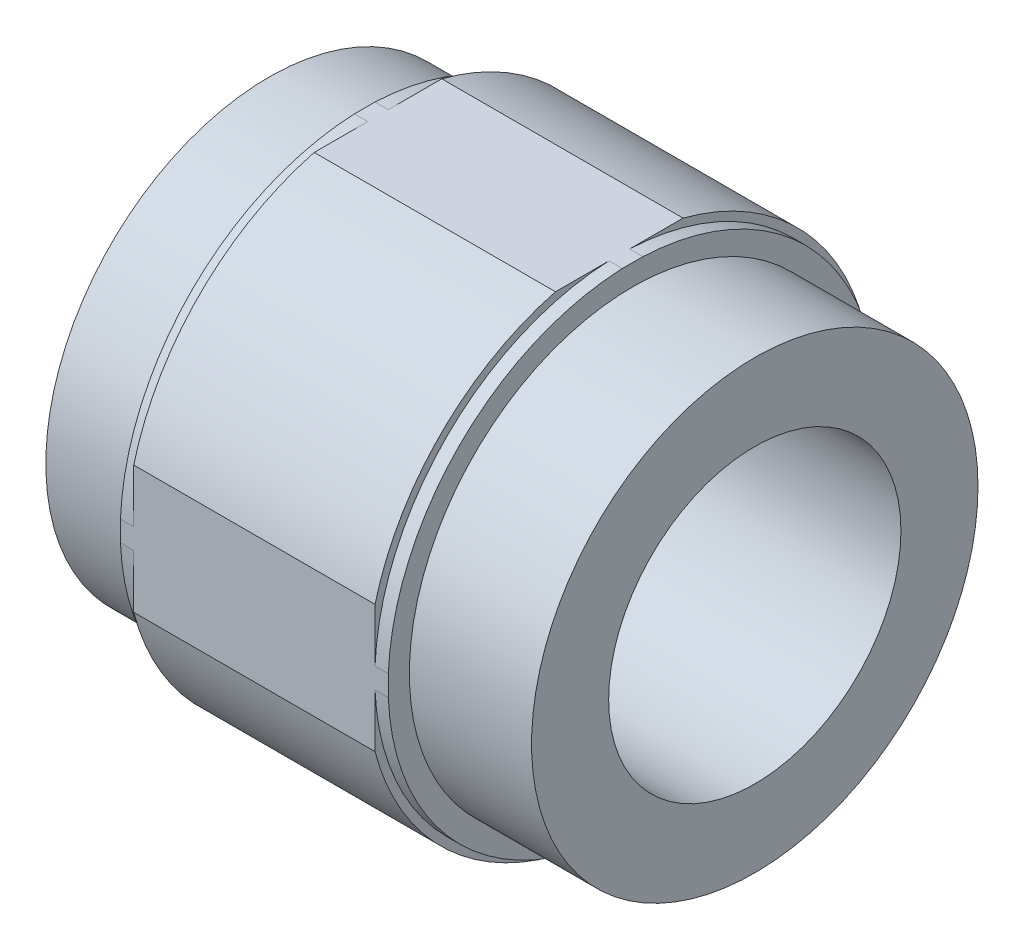
ISO-10303-21;
HEADER;
FILE_DESCRIPTION(('STEP AP214'),'2;1');
FILE_NAME('part.step','',(''),(''),'','','');
FILE_SCHEMA(('AUTOMOTIVE_DESIGN { 1 0 10303 214 1 1 1 1 }'));
ENDSEC;
DATA;
#1=APPLICATION_CONTEXT('core data for automotive mechanical design processes');
#2=APPLICATION_PROTOCOL_DEFINITION('international standard','automotive_design',2000,#1);
#3=PRODUCT_CONTEXT('',#1,'mechanical');
#4=PRODUCT('Part','Part','',(#3));
#5=PRODUCT_RELATED_PRODUCT_CATEGORY('part','',(#4));
#6=PRODUCT_DEFINITION_FORMATION('','',#4);
#7=PRODUCT_DEFINITION_CONTEXT('part definition',#1,'design');
#8=PRODUCT_DEFINITION('design','',#6,#7);
#9=PRODUCT_DEFINITION_SHAPE('','',#8);
#10=(LENGTH_UNIT() NAMED_UNIT(*) SI_UNIT(.MILLI.,.METRE.));
#11=(NAMED_UNIT(*) PLANE_ANGLE_UNIT() SI_UNIT($,.RADIAN.));
#12=(NAMED_UNIT(*) SI_UNIT($,.STERADIAN.) SOLID_ANGLE_UNIT());
#13=UNCERTAINTY_MEASURE_WITH_UNIT(LENGTH_MEASURE(1.E-05),#10,'distance_accuracy_value','');
#14=(GEOMETRIC_REPRESENTATION_CONTEXT(3) GLOBAL_UNCERTAINTY_ASSIGNED_CONTEXT((#13)) GLOBAL_UNIT_ASSIGNED_CONTEXT((#10,
#11,#12)) REPRESENTATION_CONTEXT('',''));
#15=CARTESIAN_POINT('',(0.,0.,0.));
#16=DIRECTION('',(0.,0.,1.));
#17=DIRECTION('',(1.,0.,0.));
#18=AXIS2_PLACEMENT_3D('',#15,#16,#17);
#19=CARTESIAN_POINT('',(-22.7,0.,0.));
#20=DIRECTION('',(1.,0.,0.));
#21=DIRECTION('',(0.,0.,-1.));
#22=AXIS2_PLACEMENT_3D('',#19,#20,#21);
#23=PLANE('',#22);
#24=CARTESIAN_POINT('',(-22.7,0.,0.));
#25=DIRECTION('',(1.,0.,0.));
#26=DIRECTION('',(0.,0.,-1.));
#27=AXIS2_PLACEMENT_3D('',#24,#25,#26);
#28=CIRCLE('',#27,46.);
#29=CARTESIAN_POINT('',(-22.7,-1.9364916731039,-45.959221055192));
#30=VERTEX_POINT('',#29);
#31=CARTESIAN_POINT('',(-22.7,-45.959221055192,-1.93649167310388));
#32=VERTEX_POINT('',#31);
#33=EDGE_CURVE('E191',#30,#32,#28,.F.);
#34=ORIENTED_EDGE('',*,*,#33,.F.);
#35=DIRECTION('',(0.,-1.,0.));
#36=VECTOR('',#35,1.);
#37=CARTESIAN_POINT('',(-22.7,-12.,-45.959221055192));
#38=LINE('',#37,#36);
#39=CARTESIAN_POINT('',(-22.7,-12.,-45.959221055192));
#40=VERTEX_POINT('',#39);
#41=EDGE_CURVE('E181',#30,#40,#38,.T.);
#42=ORIENTED_EDGE('',*,*,#41,.T.);
#43=CARTESIAN_POINT('',(-22.7,0.,0.));
#44=DIRECTION('',(1.,0.,0.));
#45=DIRECTION('',(0.,0.,-1.));
#46=AXIS2_PLACEMENT_3D('',#43,#44,#45);
#47=CIRCLE('',#46,47.5);
#48=CARTESIAN_POINT('',(-22.7,-45.959221055192,-12.));
#49=VERTEX_POINT('',#48);
#50=EDGE_CURVE('E21',#49,#40,#47,.T.);
#51=ORIENTED_EDGE('',*,*,#50,.F.);
#52=DIRECTION('',(0.,0.,1.));
#53=VECTOR('',#52,1.);
#54=CARTESIAN_POINT('',(-22.7,-45.959221055192,12.));
#55=LINE('',#54,#53);
#56=EDGE_CURVE('E178',#49,#32,#55,.T.);
#57=ORIENTED_EDGE('',*,*,#56,.T.);
#58=EDGE_LOOP('',(#34,#42,#51,#57));
#59=FACE_BOUND('',#58,.T.);
#60=ADVANCED_FACE('F17',(#59),#23,.F.);
#61=CARTESIAN_POINT('',(0.,0.,0.));
#62=DIRECTION('',(1.,0.,0.));
#63=DIRECTION('',(0.,0.,-1.));
#64=AXIS2_PLACEMENT_3D('',#61,#62,#63);
#65=CYLINDRICAL_SURFACE('',#64,47.5);
#66=DIRECTION('',(1.,0.,0.));
#67=VECTOR('',#66,1.);
#68=CARTESIAN_POINT('',(-25.2,-12.,-45.959221055192));
#69=LINE('',#68,#67);
#70=CARTESIAN_POINT('',(22.7,-12.,-45.959221055192));
#71=VERTEX_POINT('',#70);
#72=EDGE_CURVE('E325',#40,#71,#69,.T.);
#73=ORIENTED_EDGE('',*,*,#72,.T.);
#74=CARTESIAN_POINT('',(22.7,0.,0.));
#75=DIRECTION('',(1.,0.,0.));
#76=DIRECTION('',(0.,0.,-1.));
#77=AXIS2_PLACEMENT_3D('',#74,#75,#76);
#78=CIRCLE('',#77,47.5);
#79=CARTESIAN_POINT('',(22.7,-45.959221055192,-12.));
#80=VERTEX_POINT('',#79);
#81=EDGE_CURVE('E184',#71,#80,#78,.F.);
#82=ORIENTED_EDGE('',*,*,#81,.T.);
#83=DIRECTION('',(1.,0.,0.));
#84=VECTOR('',#83,1.);
#85=CARTESIAN_POINT('',(-25.2,-45.959221055192,-12.));
#86=LINE('',#85,#84);
#87=EDGE_CURVE('E186',#80,#49,#86,.F.);
#88=ORIENTED_EDGE('',*,*,#87,.T.);
#89=ORIENTED_EDGE('',*,*,#50,.T.);
#90=EDGE_LOOP('',(#73,#82,#88,#89));
#91=FACE_BOUND('',#90,.T.);
#92=ADVANCED_FACE('F187',(#91),#65,.T.);
#93=CARTESIAN_POINT('',(22.7,0.,0.));
#94=DIRECTION('',(-1.,0.,0.));
#95=DIRECTION('',(0.,0.,1.));
#96=AXIS2_PLACEMENT_3D('',#93,#94,#95);
#97=PLANE('',#96);
#98=ORIENTED_EDGE('',*,*,#81,.F.);
#99=DIRECTION('',(0.,-1.,0.));
#100=VECTOR('',#99,1.);
#101=CARTESIAN_POINT('',(22.7,-12.,-45.959221055192));
#102=LINE('',#101,#100);
#103=CARTESIAN_POINT('',(22.7,-1.9364916731039,-45.959221055192));
#104=VERTEX_POINT('',#103);
#105=EDGE_CURVE('E323',#71,#104,#102,.F.);
#106=ORIENTED_EDGE('',*,*,#105,.T.);
#107=CARTESIAN_POINT('',(22.7,0.,0.));
#108=DIRECTION('',(1.,0.,0.));
#109=DIRECTION('',(0.,0.,-1.));
#110=AXIS2_PLACEMENT_3D('',#107,#108,#109);
#111=CIRCLE('',#110,46.);
#112=CARTESIAN_POINT('',(22.7,-45.959221055192,-1.93649167310388));
#113=VERTEX_POINT('',#112);
#114=EDGE_CURVE('E263',#113,#104,#111,.T.);
#115=ORIENTED_EDGE('',*,*,#114,.F.);
#116=DIRECTION('',(0.,0.,1.));
#117=VECTOR('',#116,1.);
#118=CARTESIAN_POINT('',(22.7,-45.959221055192,12.));
#119=LINE('',#118,#117);
#120=EDGE_CURVE('E331',#113,#80,#119,.F.);
#121=ORIENTED_EDGE('',*,*,#120,.T.);
#122=EDGE_LOOP('',(#98,#106,#115,#121));
#123=FACE_BOUND('',#122,.T.);
#124=ADVANCED_FACE('F707',(#123),#97,.F.);
#125=CARTESIAN_POINT('',(-22.7,0.,0.));
#126=DIRECTION('',(1.,0.,0.));
#127=DIRECTION('',(0.,0.,-1.));
#128=AXIS2_PLACEMENT_3D('',#125,#126,#127);
#129=PLANE('',#128);
#130=CARTESIAN_POINT('',(-22.7,0.,0.));
#131=DIRECTION('',(1.,0.,0.));
#132=DIRECTION('',(0.,0.,-1.));
#133=AXIS2_PLACEMENT_3D('',#130,#131,#132);
#134=CIRCLE('',#133,46.);
#135=CARTESIAN_POINT('',(-22.7,45.959221055192,-1.93649167310389));
#136=VERTEX_POINT('',#135);
#137=CARTESIAN_POINT('',(-22.7,1.93649167310388,-45.959221055192));
#138=VERTEX_POINT('',#137);
#139=EDGE_CURVE('E269',#136,#138,#134,.F.);
#140=ORIENTED_EDGE('',*,*,#139,.F.);
#141=DIRECTION('',(0.,0.,-1.));
#142=VECTOR('',#141,1.);
#143=CARTESIAN_POINT('',(-22.7,45.959221055192,-12.));
#144=LINE('',#143,#142);
#145=CARTESIAN_POINT('',(-22.7,45.959221055192,-12.));
#146=VERTEX_POINT('',#145);
#147=EDGE_CURVE('E304',#136,#146,#144,.T.);
#148=ORIENTED_EDGE('',*,*,#147,.T.);
#149=CARTESIAN_POINT('',(-22.7,0.,0.));
#150=DIRECTION('',(1.,0.,0.));
#151=DIRECTION('',(0.,0.,-1.));
#152=AXIS2_PLACEMENT_3D('',#149,#150,#151);
#153=CIRCLE('',#152,47.5);
#154=CARTESIAN_POINT('',(-22.7,12.,-45.959221055192));
#155=VERTEX_POINT('',#154);
#156=EDGE_CURVE('E289',#155,#146,#153,.T.);
#157=ORIENTED_EDGE('',*,*,#156,.F.);
#158=DIRECTION('',(0.,-1.,0.));
#159=VECTOR('',#158,1.);
#160=CARTESIAN_POINT('',(-22.7,-12.,-45.959221055192));
#161=LINE('',#160,#159);
#162=EDGE_CURVE('E322',#155,#138,#161,.T.);
#163=ORIENTED_EDGE('',*,*,#162,.T.);
#164=EDGE_LOOP('',(#140,#148,#157,#163));
#165=FACE_BOUND('',#164,.T.);
#166=ADVANCED_FACE('F699',(#165),#129,.F.);
#167=CARTESIAN_POINT('',(0.,0.,0.));
#168=DIRECTION('',(1.,0.,0.));
#169=DIRECTION('',(0.,0.,-1.));
#170=AXIS2_PLACEMENT_3D('',#167,#168,#169);
#171=CYLINDRICAL_SURFACE('',#170,47.5);
#172=DIRECTION('',(1.,0.,0.));
#173=VECTOR('',#172,1.);
#174=CARTESIAN_POINT('',(-25.2,45.959221055192,-12.));
#175=LINE('',#174,#173);
#176=CARTESIAN_POINT('',(22.7,45.959221055192,-12.));
#177=VERTEX_POINT('',#176);
#178=EDGE_CURVE('E295',#146,#177,#175,.T.);
#179=ORIENTED_EDGE('',*,*,#178,.T.);
#180=CARTESIAN_POINT('',(22.7,0.,0.));
#181=DIRECTION('',(1.,0.,0.));
#182=DIRECTION('',(0.,0.,-1.));
#183=AXIS2_PLACEMENT_3D('',#180,#181,#182);
#184=CIRCLE('',#183,47.5);
#185=CARTESIAN_POINT('',(22.7,12.,-45.959221055192));
#186=VERTEX_POINT('',#185);
#187=EDGE_CURVE('E287',#177,#186,#184,.F.);
#188=ORIENTED_EDGE('',*,*,#187,.T.);
#189=DIRECTION('',(1.,0.,0.));
#190=VECTOR('',#189,1.);
#191=CARTESIAN_POINT('',(-25.2,12.,-45.959221055192));
#192=LINE('',#191,#190);
#193=EDGE_CURVE('E266',#186,#155,#192,.F.);
#194=ORIENTED_EDGE('',*,*,#193,.T.);
#195=ORIENTED_EDGE('',*,*,#156,.T.);
#196=EDGE_LOOP('',(#179,#188,#194,#195));
#197=FACE_BOUND('',#196,.T.);
#198=ADVANCED_FACE('F294',(#197),#171,.T.);
#199=CARTESIAN_POINT('',(22.7,0.,0.));
#200=DIRECTION('',(-1.,0.,0.));
#201=DIRECTION('',(0.,0.,1.));
#202=AXIS2_PLACEMENT_3D('',#199,#200,#201);
#203=PLANE('',#202);
#204=ORIENTED_EDGE('',*,*,#187,.F.);
#205=DIRECTION('',(0.,0.,-1.));
#206=VECTOR('',#205,1.);
#207=CARTESIAN_POINT('',(22.7,45.959221055192,-12.));
#208=LINE('',#207,#206);
#209=CARTESIAN_POINT('',(22.7,45.959221055192,-1.93649167310389));
#210=VERTEX_POINT('',#209);
#211=EDGE_CURVE('E306',#177,#210,#208,.F.);
#212=ORIENTED_EDGE('',*,*,#211,.T.);
#213=CARTESIAN_POINT('',(22.7,0.,0.));
#214=DIRECTION('',(1.,0.,0.));
#215=DIRECTION('',(0.,0.,-1.));
#216=AXIS2_PLACEMENT_3D('',#213,#214,#215);
#217=CIRCLE('',#216,46.);
#218=CARTESIAN_POINT('',(22.7,1.93649167310388,-45.959221055192));
#219=VERTEX_POINT('',#218);
#220=EDGE_CURVE('E258',#219,#210,#217,.T.);
#221=ORIENTED_EDGE('',*,*,#220,.F.);
#222=DIRECTION('',(0.,-1.,0.));
#223=VECTOR('',#222,1.);
#224=CARTESIAN_POINT('',(22.7,-12.,-45.959221055192));
#225=LINE('',#224,#223);
#226=EDGE_CURVE('E317',#219,#186,#225,.F.);
#227=ORIENTED_EDGE('',*,*,#226,.T.);
#228=EDGE_LOOP('',(#204,#212,#221,#227));
#229=FACE_BOUND('',#228,.T.);
#230=ADVANCED_FACE('F531',(#229),#203,.F.);
#231=CARTESIAN_POINT('',(0.,0.,0.));
#232=DIRECTION('',(1.,0.,0.));
#233=DIRECTION('',(0.,0.,-1.));
#234=AXIS2_PLACEMENT_3D('',#231,#232,#233);
#235=CYLINDRICAL_SURFACE('',#234,47.5);
#236=DIRECTION('',(1.,0.,0.));
#237=VECTOR('',#236,1.);
#238=CARTESIAN_POINT('',(-25.2,-12.,45.959221055192));
#239=LINE('',#238,#237);
#240=CARTESIAN_POINT('',(22.7,-12.,45.959221055192));
#241=VERTEX_POINT('',#240);
#242=CARTESIAN_POINT('',(-22.7,-12.,45.959221055192));
#243=VERTEX_POINT('',#242);
#244=EDGE_CURVE('E256',#241,#243,#239,.F.);
#245=ORIENTED_EDGE('',*,*,#244,.T.);
#246=CARTESIAN_POINT('',(-22.7,0.,0.));
#247=DIRECTION('',(1.,0.,0.));
#248=DIRECTION('',(0.,0.,-1.));
#249=AXIS2_PLACEMENT_3D('',#246,#247,#248);
#250=CIRCLE('',#249,47.5);
#251=CARTESIAN_POINT('',(-22.7,-45.959221055192,12.));
#252=VERTEX_POINT('',#251);
#253=EDGE_CURVE('E285',#243,#252,#250,.T.);
#254=ORIENTED_EDGE('',*,*,#253,.T.);
#255=DIRECTION('',(1.,0.,0.));
#256=VECTOR('',#255,1.);
#257=CARTESIAN_POINT('',(-25.2,-45.959221055192,12.));
#258=LINE('',#257,#256);
#259=CARTESIAN_POINT('',(22.7,-45.959221055192,12.));
#260=VERTEX_POINT('',#259);
#261=EDGE_CURVE('E333',#252,#260,#258,.T.);
#262=ORIENTED_EDGE('',*,*,#261,.T.);
#263=CARTESIAN_POINT('',(22.7,0.,0.));
#264=DIRECTION('',(1.,0.,0.));
#265=DIRECTION('',(0.,0.,-1.));
#266=AXIS2_PLACEMENT_3D('',#263,#264,#265);
#267=CIRCLE('',#266,47.5);
#268=EDGE_CURVE('E278',#260,#241,#267,.F.);
#269=ORIENTED_EDGE('',*,*,#268,.T.);
#270=EDGE_LOOP('',(#245,#254,#262,#269));
#271=FACE_BOUND('',#270,.T.);
#272=ADVANCED_FACE('F522',(#271),#235,.T.);
#273=CARTESIAN_POINT('',(-22.7,0.,0.));
#274=DIRECTION('',(1.,0.,0.));
#275=DIRECTION('',(0.,0.,-1.));
#276=AXIS2_PLACEMENT_3D('',#273,#274,#275);
#277=PLANE('',#276);
#278=ORIENTED_EDGE('',*,*,#253,.F.);
#279=DIRECTION('',(0.,1.,0.));
#280=VECTOR('',#279,1.);
#281=CARTESIAN_POINT('',(-22.7,12.,45.959221055192));
#282=LINE('',#281,#280);
#283=CARTESIAN_POINT('',(-22.7,-1.93649167310388,45.959221055192));
#284=VERTEX_POINT('',#283);
#285=EDGE_CURVE('E354',#243,#284,#282,.T.);
#286=ORIENTED_EDGE('',*,*,#285,.T.);
#287=CARTESIAN_POINT('',(-22.7,0.,0.));
#288=DIRECTION('',(1.,0.,0.));
#289=DIRECTION('',(0.,0.,-1.));
#290=AXIS2_PLACEMENT_3D('',#287,#288,#289);
#291=CIRCLE('',#290,46.);
#292=CARTESIAN_POINT('',(-22.7,-45.959221055192,1.93649167310389));
#293=VERTEX_POINT('',#292);
#294=EDGE_CURVE('E275',#293,#284,#291,.F.);
#295=ORIENTED_EDGE('',*,*,#294,.F.);
#296=DIRECTION('',(0.,0.,1.));
#297=VECTOR('',#296,1.);
#298=CARTESIAN_POINT('',(-22.7,-45.959221055192,12.));
#299=LINE('',#298,#297);
#300=EDGE_CURVE('E201',#293,#252,#299,.T.);
#301=ORIENTED_EDGE('',*,*,#300,.T.);
#302=EDGE_LOOP('',(#278,#286,#295,#301));
#303=FACE_BOUND('',#302,.T.);
#304=ADVANCED_FACE('F523',(#303),#277,.F.);
#305=CARTESIAN_POINT('',(-22.7,0.,0.));
#306=DIRECTION('',(1.,0.,0.));
#307=DIRECTION('',(0.,0.,-1.));
#308=AXIS2_PLACEMENT_3D('',#305,#306,#307);
#309=PLANE('',#308);
#310=CARTESIAN_POINT('',(-22.7,0.,0.));
#311=DIRECTION('',(1.,0.,0.));
#312=DIRECTION('',(0.,0.,-1.));
#313=AXIS2_PLACEMENT_3D('',#310,#311,#312);
#314=CIRCLE('',#313,47.5);
#315=CARTESIAN_POINT('',(-22.7,45.959221055192,12.));
#316=VERTEX_POINT('',#315);
#317=CARTESIAN_POINT('',(-22.7,12.,45.959221055192));
#318=VERTEX_POINT('',#317);
#319=EDGE_CURVE('E282',#316,#318,#314,.T.);
#320=ORIENTED_EDGE('',*,*,#319,.F.);
#321=DIRECTION('',(0.,0.,-1.));
#322=VECTOR('',#321,1.);
#323=CARTESIAN_POINT('',(-22.7,45.959221055192,-12.));
#324=LINE('',#323,#322);
#325=CARTESIAN_POINT('',(-22.7,45.959221055192,1.93649167310389));
#326=VERTEX_POINT('',#325);
#327=EDGE_CURVE('E314',#316,#326,#324,.T.);
#328=ORIENTED_EDGE('',*,*,#327,.T.);
#329=CARTESIAN_POINT('',(-22.7,0.,0.));
#330=DIRECTION('',(1.,0.,0.));
#331=DIRECTION('',(0.,0.,-1.));
#332=AXIS2_PLACEMENT_3D('',#329,#330,#331);
#333=CIRCLE('',#332,46.);
#334=CARTESIAN_POINT('',(-22.7,1.9364916731039,45.959221055192));
#335=VERTEX_POINT('',#334);
#336=EDGE_CURVE('E272',#335,#326,#333,.F.);
#337=ORIENTED_EDGE('',*,*,#336,.F.);
#338=DIRECTION('',(0.,1.,0.));
#339=VECTOR('',#338,1.);
#340=CARTESIAN_POINT('',(-22.7,12.,45.959221055192));
#341=LINE('',#340,#339);
#342=EDGE_CURVE('E359',#335,#318,#341,.T.);
#343=ORIENTED_EDGE('',*,*,#342,.T.);
#344=EDGE_LOOP('',(#320,#328,#337,#343));
#345=FACE_BOUND('',#344,.T.);
#346=ADVANCED_FACE('F376',(#345),#309,.F.);
#347=CARTESIAN_POINT('',(0.,0.,0.));
#348=DIRECTION('',(1.,0.,0.));
#349=DIRECTION('',(0.,0.,-1.));
#350=AXIS2_PLACEMENT_3D('',#347,#348,#349);
#351=CYLINDRICAL_SURFACE('',#350,47.5);
#352=DIRECTION('',(1.,0.,0.));
#353=VECTOR('',#352,1.);
#354=CARTESIAN_POINT('',(-25.2,45.959221055192,12.));
#355=LINE('',#354,#353);
#356=CARTESIAN_POINT('',(22.7,45.959221055192,12.));
#357=VERTEX_POINT('',#356);
#358=EDGE_CURVE('E261',#357,#316,#355,.F.);
#359=ORIENTED_EDGE('',*,*,#358,.T.);
#360=ORIENTED_EDGE('',*,*,#319,.T.);
#361=DIRECTION('',(1.,0.,0.));
#362=VECTOR('',#361,1.);
#363=CARTESIAN_POINT('',(-25.2,12.,45.959221055192));
#364=LINE('',#363,#362);
#365=CARTESIAN_POINT('',(22.7,12.,45.959221055192));
#366=VERTEX_POINT('',#365);
#367=EDGE_CURVE('E357',#318,#366,#364,.T.);
#368=ORIENTED_EDGE('',*,*,#367,.T.);
#369=CARTESIAN_POINT('',(22.7,0.,0.));
#370=DIRECTION('',(1.,0.,0.));
#371=DIRECTION('',(0.,0.,-1.));
#372=AXIS2_PLACEMENT_3D('',#369,#370,#371);
#373=CIRCLE('',#372,47.5);
#374=EDGE_CURVE('E280',#366,#357,#373,.F.);
#375=ORIENTED_EDGE('',*,*,#374,.T.);
#376=EDGE_LOOP('',(#359,#360,#368,#375));
#377=FACE_BOUND('',#376,.T.);
#378=ADVANCED_FACE('F370',(#377),#351,.T.);
#379=CARTESIAN_POINT('',(22.7,0.,0.));
#380=DIRECTION('',(-1.,0.,0.));
#381=DIRECTION('',(0.,0.,1.));
#382=AXIS2_PLACEMENT_3D('',#379,#380,#381);
#383=PLANE('',#382);
#384=CARTESIAN_POINT('',(22.7,0.,0.));
#385=DIRECTION('',(1.,0.,0.));
#386=DIRECTION('',(0.,0.,-1.));
#387=AXIS2_PLACEMENT_3D('',#384,#385,#386);
#388=CIRCLE('',#387,46.);
#389=CARTESIAN_POINT('',(22.7,45.959221055192,1.93649167310389));
#390=VERTEX_POINT('',#389);
#391=CARTESIAN_POINT('',(22.7,1.9364916731039,45.959221055192));
#392=VERTEX_POINT('',#391);
#393=EDGE_CURVE('E253',#390,#392,#388,.T.);
#394=ORIENTED_EDGE('',*,*,#393,.F.);
#395=DIRECTION('',(0.,0.,-1.));
#396=VECTOR('',#395,1.);
#397=CARTESIAN_POINT('',(22.7,45.959221055192,-12.));
#398=LINE('',#397,#396);
#399=EDGE_CURVE('E364',#390,#357,#398,.F.);
#400=ORIENTED_EDGE('',*,*,#399,.T.);
#401=ORIENTED_EDGE('',*,*,#374,.F.);
#402=DIRECTION('',(0.,1.,0.));
#403=VECTOR('',#402,1.);
#404=CARTESIAN_POINT('',(22.7,12.,45.959221055192));
#405=LINE('',#404,#403);
#406=EDGE_CURVE('E355',#366,#392,#405,.F.);
#407=ORIENTED_EDGE('',*,*,#406,.T.);
#408=EDGE_LOOP('',(#394,#400,#401,#407));
#409=FACE_BOUND('',#408,.T.);
#410=ADVANCED_FACE('F389',(#409),#383,.F.);
#411=CARTESIAN_POINT('',(22.7,0.,0.));
#412=DIRECTION('',(-1.,0.,0.));
#413=DIRECTION('',(0.,0.,1.));
#414=AXIS2_PLACEMENT_3D('',#411,#412,#413);
#415=PLANE('',#414);
#416=CARTESIAN_POINT('',(22.7,0.,0.));
#417=DIRECTION('',(1.,0.,0.));
#418=DIRECTION('',(0.,0.,-1.));
#419=AXIS2_PLACEMENT_3D('',#416,#417,#418);
#420=CIRCLE('',#419,46.);
#421=CARTESIAN_POINT('',(22.7,-1.93649167310387,45.959221055192));
#422=VERTEX_POINT('',#421);
#423=CARTESIAN_POINT('',(22.7,-45.959221055192,1.9364916731039));
#424=VERTEX_POINT('',#423);
#425=EDGE_CURVE('E250',#422,#424,#420,.T.);
#426=ORIENTED_EDGE('',*,*,#425,.F.);
#427=DIRECTION('',(0.,1.,0.));
#428=VECTOR('',#427,1.);
#429=CARTESIAN_POINT('',(22.7,12.,45.959221055192));
#430=LINE('',#429,#428);
#431=EDGE_CURVE('E348',#422,#241,#430,.F.);
#432=ORIENTED_EDGE('',*,*,#431,.T.);
#433=ORIENTED_EDGE('',*,*,#268,.F.);
#434=DIRECTION('',(0.,0.,1.));
#435=VECTOR('',#434,1.);
#436=CARTESIAN_POINT('',(22.7,-45.959221055192,12.));
#437=LINE('',#436,#435);
#438=EDGE_CURVE('E332',#260,#424,#437,.F.);
#439=ORIENTED_EDGE('',*,*,#438,.T.);
#440=EDGE_LOOP('',(#426,#432,#433,#439));
#441=FACE_BOUND('',#440,.T.);
#442=ADVANCED_FACE('F520',(#441),#415,.F.);
#443=CARTESIAN_POINT('',(-25.2,0.,0.));
#444=DIRECTION('',(1.,0.,0.));
#445=DIRECTION('',(0.,0.,-1.));
#446=AXIS2_PLACEMENT_3D('',#443,#444,#445);
#447=CYLINDRICAL_SURFACE('',#446,46.);
#448=DIRECTION('',(1.,0.,0.));
#449=VECTOR('',#448,1.);
#450=CARTESIAN_POINT('',(-25.2,-1.93649167310383,45.959221055192));
#451=LINE('',#450,#449);
#452=CARTESIAN_POINT('',(-25.2,-1.93649167310388,45.959221055192));
#453=VERTEX_POINT('',#452);
#454=EDGE_CURVE('E363',#284,#453,#451,.F.);
#455=ORIENTED_EDGE('',*,*,#454,.T.);
#456=CARTESIAN_POINT('',(-25.2,0.,0.));
#457=DIRECTION('',(1.,0.,0.));
#458=DIRECTION('',(0.,0.,-1.));
#459=AXIS2_PLACEMENT_3D('',#456,#457,#458);
#460=CIRCLE('',#459,46.);
#461=CARTESIAN_POINT('',(-25.2,-45.959221055192,1.93649167310389));
#462=VERTEX_POINT('',#461);
#463=EDGE_CURVE('E246',#462,#453,#460,.F.);
#464=ORIENTED_EDGE('',*,*,#463,.F.);
#465=DIRECTION('',(1.,0.,0.));
#466=VECTOR('',#465,1.);
#467=CARTESIAN_POINT('',(-25.2,-45.959221055192,1.93649167310384));
#468=LINE('',#467,#466);
#469=EDGE_CURVE('E198',#462,#293,#468,.T.);
#470=ORIENTED_EDGE('',*,*,#469,.T.);
#471=ORIENTED_EDGE('',*,*,#294,.T.);
#472=EDGE_LOOP('',(#455,#464,#470,#471));
#473=FACE_BOUND('',#472,.T.);
#474=ADVANCED_FACE('F427',(#473),#447,.T.);
#475=CARTESIAN_POINT('',(-25.2,0.,0.));
#476=DIRECTION('',(1.,0.,0.));
#477=DIRECTION('',(0.,0.,-1.));
#478=AXIS2_PLACEMENT_3D('',#475,#476,#477);
#479=CYLINDRICAL_SURFACE('',#478,46.);
#480=DIRECTION('',(1.,0.,0.));
#481=VECTOR('',#480,1.);
#482=CARTESIAN_POINT('',(-25.2,45.959221055192,1.93649167310384));
#483=LINE('',#482,#481);
#484=CARTESIAN_POINT('',(-25.2,45.959221055192,1.93649167310389));
#485=VERTEX_POINT('',#484);
#486=EDGE_CURVE('E316',#326,#485,#483,.F.);
#487=ORIENTED_EDGE('',*,*,#486,.T.);
#488=CARTESIAN_POINT('',(-25.2,0.,0.));
#489=DIRECTION('',(1.,0.,0.));
#490=DIRECTION('',(0.,0.,-1.));
#491=AXIS2_PLACEMENT_3D('',#488,#489,#490);
#492=CIRCLE('',#491,46.);
#493=CARTESIAN_POINT('',(-25.2,1.93649167310389,45.959221055192));
#494=VERTEX_POINT('',#493);
#495=EDGE_CURVE('E242',#494,#485,#492,.F.);
#496=ORIENTED_EDGE('',*,*,#495,.F.);
#497=DIRECTION('',(1.,0.,0.));
#498=VECTOR('',#497,1.);
#499=CARTESIAN_POINT('',(-25.2,1.93649167310385,45.959221055192));
#500=LINE('',#499,#498);
#501=EDGE_CURVE('E361',#494,#335,#500,.T.);
#502=ORIENTED_EDGE('',*,*,#501,.T.);
#503=ORIENTED_EDGE('',*,*,#336,.T.);
#504=EDGE_LOOP('',(#487,#496,#502,#503));
#505=FACE_BOUND('',#504,.T.);
#506=ADVANCED_FACE('F379',(#505),#479,.T.);
#507=CARTESIAN_POINT('',(-25.2,0.,0.));
#508=DIRECTION('',(1.,0.,0.));
#509=DIRECTION('',(0.,0.,-1.));
#510=AXIS2_PLACEMENT_3D('',#507,#508,#509);
#511=CYLINDRICAL_SURFACE('',#510,46.);
#512=DIRECTION('',(1.,0.,0.));
#513=VECTOR('',#512,1.);
#514=CARTESIAN_POINT('',(-25.2,45.959221055192,-1.93649167310384));
#515=LINE('',#514,#513);
#516=CARTESIAN_POINT('',(-25.2,45.959221055192,-1.93649167310389));
#517=VERTEX_POINT('',#516);
#518=EDGE_CURVE('E310',#517,#136,#515,.T.);
#519=ORIENTED_EDGE('',*,*,#518,.T.);
#520=ORIENTED_EDGE('',*,*,#139,.T.);
#521=DIRECTION('',(1.,0.,0.));
#522=VECTOR('',#521,1.);
#523=CARTESIAN_POINT('',(-25.2,1.93649167310383,-45.959221055192));
#524=LINE('',#523,#522);
#525=CARTESIAN_POINT('',(-25.2,1.93649167310388,-45.959221055192));
#526=VERTEX_POINT('',#525);
#527=EDGE_CURVE('E330',#138,#526,#524,.F.);
#528=ORIENTED_EDGE('',*,*,#527,.T.);
#529=CARTESIAN_POINT('',(-25.2,0.,0.));
#530=DIRECTION('',(1.,0.,0.));
#531=DIRECTION('',(0.,0.,-1.));
#532=AXIS2_PLACEMENT_3D('',#529,#530,#531);
#533=CIRCLE('',#532,46.);
#534=EDGE_CURVE('E238',#517,#526,#533,.F.);
#535=ORIENTED_EDGE('',*,*,#534,.F.);
#536=EDGE_LOOP('',(#519,#520,#528,#535));
#537=FACE_BOUND('',#536,.T.);
#538=ADVANCED_FACE('F446',(#537),#511,.T.);
#539=CARTESIAN_POINT('',(-25.2,0.,0.));
#540=DIRECTION('',(1.,0.,0.));
#541=DIRECTION('',(0.,0.,-1.));
#542=AXIS2_PLACEMENT_3D('',#539,#540,#541);
#543=CYLINDRICAL_SURFACE('',#542,46.);
#544=DIRECTION('',(1.,0.,0.));
#545=VECTOR('',#544,1.);
#546=CARTESIAN_POINT('',(-25.2,-1.93649167310385,-45.959221055192));
#547=LINE('',#546,#545);
#548=CARTESIAN_POINT('',(-25.2,-1.93649167310389,-45.959221055192));
#549=VERTEX_POINT('',#548);
#550=EDGE_CURVE('E328',#549,#30,#547,.T.);
#551=ORIENTED_EDGE('',*,*,#550,.T.);
#552=ORIENTED_EDGE('',*,*,#33,.T.);
#553=DIRECTION('',(1.,0.,0.));
#554=VECTOR('',#553,1.);
#555=CARTESIAN_POINT('',(-25.2,-45.959221055192,-1.93649167310383));
#556=LINE('',#555,#554);
#557=CARTESIAN_POINT('',(-25.2,-45.959221055192,-1.93649167310389));
#558=VERTEX_POINT('',#557);
#559=EDGE_CURVE('E196',#32,#558,#556,.F.);
#560=ORIENTED_EDGE('',*,*,#559,.T.);
#561=CARTESIAN_POINT('',(-25.2,0.,0.));
#562=DIRECTION('',(1.,0.,0.));
#563=DIRECTION('',(0.,0.,-1.));
#564=AXIS2_PLACEMENT_3D('',#561,#562,#563);
#565=CIRCLE('',#564,46.);
#566=EDGE_CURVE('E234',#549,#558,#565,.F.);
#567=ORIENTED_EDGE('',*,*,#566,.F.);
#568=EDGE_LOOP('',(#551,#552,#560,#567));
#569=FACE_BOUND('',#568,.T.);
#570=ADVANCED_FACE('F444',(#569),#543,.T.);
#571=CARTESIAN_POINT('',(-25.2,-45.959221055192,12.));
#572=DIRECTION('',(0.,1.,0.));
#573=DIRECTION('',(0.,0.,1.));
#574=AXIS2_PLACEMENT_3D('',#571,#572,#573);
#575=PLANE('',#574);
#576=DIRECTION('',(1.,0.,0.));
#577=VECTOR('',#576,1.);
#578=CARTESIAN_POINT('',(25.2,-45.959221055192,-1.93649167310383));
#579=LINE('',#578,#577);
#580=CARTESIAN_POINT('',(25.2,-45.959221055192,-1.9364916731038));
#581=VERTEX_POINT('',#580);
#582=EDGE_CURVE('E267',#581,#113,#579,.F.);
#583=ORIENTED_EDGE('',*,*,#582,.F.);
#584=DIRECTION('',(0.,0.,-1.));
#585=VECTOR('',#584,1.);
#586=CARTESIAN_POINT('',(25.2,-45.959221055192,0.));
#587=LINE('',#586,#585);
#588=CARTESIAN_POINT('',(25.2,-45.959221055192,1.93649167310381));
#589=VERTEX_POINT('',#588);
#590=EDGE_CURVE('E233',#589,#581,#587,.T.);
#591=ORIENTED_EDGE('',*,*,#590,.F.);
#592=DIRECTION('',(1.,0.,0.));
#593=VECTOR('',#592,1.);
#594=CARTESIAN_POINT('',(25.2,-45.959221055192,1.93649167310385));
#595=LINE('',#594,#593);
#596=EDGE_CURVE('E350',#424,#589,#595,.T.);
#597=ORIENTED_EDGE('',*,*,#596,.F.);
#598=ORIENTED_EDGE('',*,*,#438,.F.);
#599=ORIENTED_EDGE('',*,*,#261,.F.);
#600=ORIENTED_EDGE('',*,*,#300,.F.);
#601=ORIENTED_EDGE('',*,*,#469,.F.);
#602=DIRECTION('',(0.,0.,1.));
#603=VECTOR('',#602,1.);
#604=CARTESIAN_POINT('',(-25.2,-45.959221055192,0.));
#605=LINE('',#604,#603);
#606=EDGE_CURVE('E249',#558,#462,#605,.T.);
#607=ORIENTED_EDGE('',*,*,#606,.F.);
#608=ORIENTED_EDGE('',*,*,#559,.F.);
#609=ORIENTED_EDGE('',*,*,#56,.F.);
#610=ORIENTED_EDGE('',*,*,#87,.F.);
#611=ORIENTED_EDGE('',*,*,#120,.F.);
#612=EDGE_LOOP('',(#583,#591,#597,#598,#599,#600,#601,#607,#608,#609,#610,#611));
#613=FACE_BOUND('',#612,.T.);
#614=ADVANCED_FACE('F194',(#613),#575,.F.);
#615=CARTESIAN_POINT('',(25.2,0.,0.));
#616=DIRECTION('',(1.,0.,0.));
#617=DIRECTION('',(0.,0.,-1.));
#618=AXIS2_PLACEMENT_3D('',#615,#616,#617);
#619=CYLINDRICAL_SURFACE('',#618,46.);
#620=DIRECTION('',(1.,0.,0.));
#621=VECTOR('',#620,1.);
#622=CARTESIAN_POINT('',(-25.2,-1.93649167310385,-45.959221055192));
#623=LINE('',#622,#621);
#624=CARTESIAN_POINT('',(25.2,-1.93649167310389,-45.959221055192));
#625=VERTEX_POINT('',#624);
#626=EDGE_CURVE('E320',#104,#625,#623,.T.);
#627=ORIENTED_EDGE('',*,*,#626,.T.);
#628=CARTESIAN_POINT('',(25.2,0.,0.));
#629=DIRECTION('',(1.,0.,0.));
#630=DIRECTION('',(0.,0.,-1.));
#631=AXIS2_PLACEMENT_3D('',#628,#629,#630);
#632=CIRCLE('',#631,46.);
#633=EDGE_CURVE('E230',#581,#625,#632,.T.);
#634=ORIENTED_EDGE('',*,*,#633,.F.);
#635=ORIENTED_EDGE('',*,*,#582,.T.);
#636=ORIENTED_EDGE('',*,*,#114,.T.);
#637=EDGE_LOOP('',(#627,#634,#635,#636));
#638=FACE_BOUND('',#637,.T.);
#639=ADVANCED_FACE('F453',(#638),#619,.T.);
#640=CARTESIAN_POINT('',(-25.2,-12.,-45.959221055192));
#641=DIRECTION('',(0.,0.,1.));
#642=DIRECTION('',(0.,-1.,0.));
#643=AXIS2_PLACEMENT_3D('',#640,#641,#642);
#644=PLANE('',#643);
#645=DIRECTION('',(1.,0.,0.));
#646=VECTOR('',#645,1.);
#647=CARTESIAN_POINT('',(25.2,1.93649167310383,-45.959221055192));
#648=LINE('',#647,#646);
#649=CARTESIAN_POINT('',(25.2,1.93649167310388,-45.959221055192));
#650=VERTEX_POINT('',#649);
#651=EDGE_CURVE('E262',#650,#219,#648,.F.);
#652=ORIENTED_EDGE('',*,*,#651,.F.);
#653=DIRECTION('',(0.,1.,0.));
#654=VECTOR('',#653,1.);
#655=CARTESIAN_POINT('',(25.2,44.75,-45.959221055192));
#656=LINE('',#655,#654);
#657=EDGE_CURVE('E229',#625,#650,#656,.T.);
#658=ORIENTED_EDGE('',*,*,#657,.F.);
#659=ORIENTED_EDGE('',*,*,#626,.F.);
#660=ORIENTED_EDGE('',*,*,#105,.F.);
#661=ORIENTED_EDGE('',*,*,#72,.F.);
#662=ORIENTED_EDGE('',*,*,#41,.F.);
#663=ORIENTED_EDGE('',*,*,#550,.F.);
#664=DIRECTION('',(0.,1.,0.));
#665=VECTOR('',#664,1.);
#666=CARTESIAN_POINT('',(-25.2,44.75,-45.959221055192));
#667=LINE('',#666,#665);
#668=EDGE_CURVE('E237',#526,#549,#667,.F.);
#669=ORIENTED_EDGE('',*,*,#668,.F.);
#670=ORIENTED_EDGE('',*,*,#527,.F.);
#671=ORIENTED_EDGE('',*,*,#162,.F.);
#672=ORIENTED_EDGE('',*,*,#193,.F.);
#673=ORIENTED_EDGE('',*,*,#226,.F.);
#674=EDGE_LOOP('',(#652,#658,#659,#660,#661,#662,#663,#669,#670,#671,#672,#673));
#675=FACE_BOUND('',#674,.T.);
#676=ADVANCED_FACE('F442',(#675),#644,.F.);
#677=CARTESIAN_POINT('',(25.2,0.,0.));
#678=DIRECTION('',(1.,0.,0.));
#679=DIRECTION('',(0.,0.,-1.));
#680=AXIS2_PLACEMENT_3D('',#677,#678,#679);
#681=CYLINDRICAL_SURFACE('',#680,46.);
#682=DIRECTION('',(1.,0.,0.));
#683=VECTOR('',#682,1.);
#684=CARTESIAN_POINT('',(-25.2,45.959221055192,-1.93649167310384));
#685=LINE('',#684,#683);
#686=CARTESIAN_POINT('',(25.2,45.959221055192,-1.93649167310389));
#687=VERTEX_POINT('',#686);
#688=EDGE_CURVE('E308',#210,#687,#685,.T.);
#689=ORIENTED_EDGE('',*,*,#688,.T.);
#690=CARTESIAN_POINT('',(25.2,0.,0.));
#691=DIRECTION('',(1.,0.,0.));
#692=DIRECTION('',(0.,0.,-1.));
#693=AXIS2_PLACEMENT_3D('',#690,#691,#692);
#694=CIRCLE('',#693,46.);
#695=EDGE_CURVE('E226',#650,#687,#694,.T.);
#696=ORIENTED_EDGE('',*,*,#695,.F.);
#697=ORIENTED_EDGE('',*,*,#651,.T.);
#698=ORIENTED_EDGE('',*,*,#220,.T.);
#699=EDGE_LOOP('',(#689,#696,#697,#698));
#700=FACE_BOUND('',#699,.T.);
#701=ADVANCED_FACE('F501',(#700),#681,.T.);
#702=CARTESIAN_POINT('',(-25.2,45.959221055192,-12.));
#703=DIRECTION('',(0.,-1.,0.));
#704=DIRECTION('',(0.,0.,-1.));
#705=AXIS2_PLACEMENT_3D('',#702,#703,#704);
#706=PLANE('',#705);
#707=DIRECTION('',(1.,0.,0.));
#708=VECTOR('',#707,1.);
#709=CARTESIAN_POINT('',(25.2,45.959221055192,1.93649167310384));
#710=LINE('',#709,#708);
#711=CARTESIAN_POINT('',(25.2,45.959221055192,1.93649167310389));
#712=VERTEX_POINT('',#711);
#713=EDGE_CURVE('E257',#712,#390,#710,.F.);
#714=ORIENTED_EDGE('',*,*,#713,.F.);
#715=DIRECTION('',(0.,0.,-1.));
#716=VECTOR('',#715,1.);
#717=CARTESIAN_POINT('',(25.2,45.959221055192,0.));
#718=LINE('',#717,#716);
#719=EDGE_CURVE('E225',#687,#712,#718,.F.);
#720=ORIENTED_EDGE('',*,*,#719,.F.);
#721=ORIENTED_EDGE('',*,*,#688,.F.);
#722=ORIENTED_EDGE('',*,*,#211,.F.);
#723=ORIENTED_EDGE('',*,*,#178,.F.);
#724=ORIENTED_EDGE('',*,*,#147,.F.);
#725=ORIENTED_EDGE('',*,*,#518,.F.);
#726=DIRECTION('',(0.,0.,1.));
#727=VECTOR('',#726,1.);
#728=CARTESIAN_POINT('',(-25.2,45.959221055192,0.));
#729=LINE('',#728,#727);
#730=EDGE_CURVE('E241',#485,#517,#729,.F.);
#731=ORIENTED_EDGE('',*,*,#730,.F.);
#732=ORIENTED_EDGE('',*,*,#486,.F.);
#733=ORIENTED_EDGE('',*,*,#327,.F.);
#734=ORIENTED_EDGE('',*,*,#358,.F.);
#735=ORIENTED_EDGE('',*,*,#399,.F.);
#736=EDGE_LOOP('',(#714,#720,#721,#722,#723,#724,#725,#731,#732,#733,#734,#735));
#737=FACE_BOUND('',#736,.T.);
#738=ADVANCED_FACE('F303',(#737),#706,.F.);
#739=CARTESIAN_POINT('',(25.2,0.,0.));
#740=DIRECTION('',(1.,0.,0.));
#741=DIRECTION('',(0.,0.,-1.));
#742=AXIS2_PLACEMENT_3D('',#739,#740,#741);
#743=CYLINDRICAL_SURFACE('',#742,46.);
#744=ORIENTED_EDGE('',*,*,#713,.T.);
#745=ORIENTED_EDGE('',*,*,#393,.T.);
#746=DIRECTION('',(1.,0.,0.));
#747=VECTOR('',#746,1.);
#748=CARTESIAN_POINT('',(-25.2,1.93649167310385,45.959221055192));
#749=LINE('',#748,#747);
#750=CARTESIAN_POINT('',(25.2,1.93649167310389,45.959221055192));
#751=VERTEX_POINT('',#750);
#752=EDGE_CURVE('E351',#392,#751,#749,.T.);
#753=ORIENTED_EDGE('',*,*,#752,.T.);
#754=CARTESIAN_POINT('',(25.2,0.,0.));
#755=DIRECTION('',(1.,0.,0.));
#756=DIRECTION('',(0.,0.,-1.));
#757=AXIS2_PLACEMENT_3D('',#754,#755,#756);
#758=CIRCLE('',#757,46.);
#759=EDGE_CURVE('E222',#712,#751,#758,.T.);
#760=ORIENTED_EDGE('',*,*,#759,.F.);
#761=EDGE_LOOP('',(#744,#745,#753,#760));
#762=FACE_BOUND('',#761,.T.);
#763=ADVANCED_FACE('F396',(#762),#743,.T.);
#764=CARTESIAN_POINT('',(-25.2,12.,45.959221055192));
#765=DIRECTION('',(0.,0.,-1.));
#766=DIRECTION('',(0.,1.,0.));
#767=AXIS2_PLACEMENT_3D('',#764,#765,#766);
#768=PLANE('',#767);
#769=DIRECTION('',(1.,0.,0.));
#770=VECTOR('',#769,1.);
#771=CARTESIAN_POINT('',(25.2,-1.93649167310381,45.959221055192));
#772=LINE('',#771,#770);
#773=CARTESIAN_POINT('',(25.2,-1.93649167310388,45.959221055192));
#774=VERTEX_POINT('',#773);
#775=EDGE_CURVE('E36',#774,#422,#772,.F.);
#776=ORIENTED_EDGE('',*,*,#775,.F.);
#777=DIRECTION('',(0.,1.,0.));
#778=VECTOR('',#777,1.);
#779=CARTESIAN_POINT('',(25.2,44.75,45.959221055192));
#780=LINE('',#779,#778);
#781=EDGE_CURVE('E221',#751,#774,#780,.F.);
#782=ORIENTED_EDGE('',*,*,#781,.F.);
#783=ORIENTED_EDGE('',*,*,#752,.F.);
#784=ORIENTED_EDGE('',*,*,#406,.F.);
#785=ORIENTED_EDGE('',*,*,#367,.F.);
#786=ORIENTED_EDGE('',*,*,#342,.F.);
#787=ORIENTED_EDGE('',*,*,#501,.F.);
#788=DIRECTION('',(0.,1.,0.));
#789=VECTOR('',#788,1.);
#790=CARTESIAN_POINT('',(-25.2,44.75,45.959221055192));
#791=LINE('',#790,#789);
#792=EDGE_CURVE('E245',#453,#494,#791,.T.);
#793=ORIENTED_EDGE('',*,*,#792,.F.);
#794=ORIENTED_EDGE('',*,*,#454,.F.);
#795=ORIENTED_EDGE('',*,*,#285,.F.);
#796=ORIENTED_EDGE('',*,*,#244,.F.);
#797=ORIENTED_EDGE('',*,*,#431,.F.);
#798=EDGE_LOOP('',(#776,#782,#783,#784,#785,#786,#787,#793,#794,#795,#796,#797));
#799=FACE_BOUND('',#798,.T.);
#800=ADVANCED_FACE('F384',(#799),#768,.F.);
#801=CARTESIAN_POINT('',(25.2,0.,0.));
#802=DIRECTION('',(1.,0.,0.));
#803=DIRECTION('',(0.,0.,-1.));
#804=AXIS2_PLACEMENT_3D('',#801,#802,#803);
#805=CYLINDRICAL_SURFACE('',#804,46.);
#806=ORIENTED_EDGE('',*,*,#775,.T.);
#807=ORIENTED_EDGE('',*,*,#425,.T.);
#808=ORIENTED_EDGE('',*,*,#596,.T.);
#809=CARTESIAN_POINT('',(25.2,0.,0.));
#810=DIRECTION('',(1.,0.,0.));
#811=DIRECTION('',(0.,0.,-1.));
#812=AXIS2_PLACEMENT_3D('',#809,#810,#811);
#813=CIRCLE('',#812,46.);
#814=EDGE_CURVE('E218',#774,#589,#813,.T.);
#815=ORIENTED_EDGE('',*,*,#814,.F.);
#816=EDGE_LOOP('',(#806,#807,#808,#815));
#817=FACE_BOUND('',#816,.T.);
#818=ADVANCED_FACE('F490',(#817),#805,.T.);
#819=CARTESIAN_POINT('',(-25.2,44.75,0.));
#820=DIRECTION('',(-1.,0.,0.));
#821=DIRECTION('',(0.,0.,1.));
#822=AXIS2_PLACEMENT_3D('',#819,#820,#821);
#823=PLANE('',#822);
#824=CARTESIAN_POINT('',(-25.2,0.,0.));
#825=DIRECTION('',(1.,0.,0.));
#826=DIRECTION('',(0.,0.,-1.));
#827=AXIS2_PLACEMENT_3D('',#824,#825,#826);
#828=CIRCLE('',#827,42.);
#829=CARTESIAN_POINT('',(-25.2,0.,-42.));
#830=VERTEX_POINT('',#829);
#831=EDGE_CURVE('E215',#830,#830,#828,.F.);
#832=ORIENTED_EDGE('',*,*,#831,.F.);
#833=EDGE_LOOP('',(#832));
#834=FACE_BOUND('',#833,.T.);
#835=ORIENTED_EDGE('',*,*,#668,.T.);
#836=ORIENTED_EDGE('',*,*,#566,.T.);
#837=ORIENTED_EDGE('',*,*,#606,.T.);
#838=ORIENTED_EDGE('',*,*,#463,.T.);
#839=ORIENTED_EDGE('',*,*,#792,.T.);
#840=ORIENTED_EDGE('',*,*,#495,.T.);
#841=ORIENTED_EDGE('',*,*,#730,.T.);
#842=ORIENTED_EDGE('',*,*,#534,.T.);
#843=EDGE_LOOP('',(#835,#836,#837,#838,#839,#840,#841,#842));
#844=FACE_BOUND('',#843,.T.);
#845=ADVANCED_FACE('F433',(#834,#844),#823,.T.);
#846=CARTESIAN_POINT('',(25.2,44.75,0.));
#847=DIRECTION('',(1.,0.,0.));
#848=DIRECTION('',(0.,0.,-1.));
#849=AXIS2_PLACEMENT_3D('',#846,#847,#848);
#850=PLANE('',#849);
#851=ORIENTED_EDGE('',*,*,#781,.T.);
#852=ORIENTED_EDGE('',*,*,#814,.T.);
#853=ORIENTED_EDGE('',*,*,#590,.T.);
#854=ORIENTED_EDGE('',*,*,#633,.T.);
#855=ORIENTED_EDGE('',*,*,#657,.T.);
#856=ORIENTED_EDGE('',*,*,#695,.T.);
#857=ORIENTED_EDGE('',*,*,#719,.T.);
#858=ORIENTED_EDGE('',*,*,#759,.T.);
#859=EDGE_LOOP('',(#851,#852,#853,#854,#855,#856,#857,#858));
#860=FACE_BOUND('',#859,.T.);
#861=CARTESIAN_POINT('',(25.2,0.,0.));
#862=DIRECTION('',(1.,0.,0.));
#863=DIRECTION('',(0.,0.,-1.));
#864=AXIS2_PLACEMENT_3D('',#861,#862,#863);
#865=CIRCLE('',#864,42.);
#866=CARTESIAN_POINT('',(25.2,0.,-42.));
#867=VERTEX_POINT('',#866);
#868=EDGE_CURVE('E212',#867,#867,#865,.T.);
#869=ORIENTED_EDGE('',*,*,#868,.F.);
#870=EDGE_LOOP('',(#869));
#871=FACE_BOUND('',#870,.T.);
#872=ADVANCED_FACE('F399',(#860,#871),#850,.T.);
#873=CARTESIAN_POINT('',(-34.2,0.,0.));
#874=DIRECTION('',(1.,0.,0.));
#875=DIRECTION('',(0.,0.,-1.));
#876=AXIS2_PLACEMENT_3D('',#873,#874,#875);
#877=CYLINDRICAL_SURFACE('',#876,42.);
#878=ORIENTED_EDGE('',*,*,#831,.T.);
#879=EDGE_LOOP('',(#878));
#880=FACE_BOUND('',#879,.T.);
#881=CARTESIAN_POINT('',(-43.2,0.,0.));
#882=DIRECTION('',(1.,0.,0.));
#883=DIRECTION('',(0.,0.,-1.));
#884=AXIS2_PLACEMENT_3D('',#881,#882,#883);
#885=CIRCLE('',#884,42.);
#886=CARTESIAN_POINT('',(-43.2,0.,-42.));
#887=VERTEX_POINT('',#886);
#888=EDGE_CURVE('E209',#887,#887,#885,.F.);
#889=ORIENTED_EDGE('',*,*,#888,.F.);
#890=EDGE_LOOP('',(#889));
#891=FACE_BOUND('',#890,.T.);
#892=ADVANCED_FACE('F476',(#880,#891),#877,.T.);
#893=CARTESIAN_POINT('',(36.7,0.,0.));
#894=DIRECTION('',(1.,0.,0.));
#895=DIRECTION('',(0.,0.,-1.));
#896=AXIS2_PLACEMENT_3D('',#893,#894,#895);
#897=CYLINDRICAL_SURFACE('',#896,42.);
#898=CARTESIAN_POINT('',(48.2,0.,0.));
#899=DIRECTION('',(1.,0.,0.));
#900=DIRECTION('',(0.,0.,-1.));
#901=AXIS2_PLACEMENT_3D('',#898,#899,#900);
#902=CIRCLE('',#901,42.);
#903=CARTESIAN_POINT('',(48.2,0.,-42.));
#904=VERTEX_POINT('',#903);
#905=EDGE_CURVE('E206',#904,#904,#902,.T.);
#906=ORIENTED_EDGE('',*,*,#905,.F.);
#907=EDGE_LOOP('',(#906));
#908=FACE_BOUND('',#907,.T.);
#909=ORIENTED_EDGE('',*,*,#868,.T.);
#910=EDGE_LOOP('',(#909));
#911=FACE_BOUND('',#910,.T.);
#912=ADVANCED_FACE('F472',(#908,#911),#897,.T.);
#913=CARTESIAN_POINT('',(-43.2,34.75,0.));
#914=DIRECTION('',(-1.,0.,0.));
#915=DIRECTION('',(0.,0.,1.));
#916=AXIS2_PLACEMENT_3D('',#913,#914,#915);
#917=PLANE('',#916);
#918=CARTESIAN_POINT('',(-43.2,0.,0.));
#919=DIRECTION('',(1.,0.,0.));
#920=DIRECTION('',(0.,0.,-1.));
#921=AXIS2_PLACEMENT_3D('',#918,#919,#920);
#922=CIRCLE('',#921,27.5);
#923=CARTESIAN_POINT('',(-43.2,0.,-27.5));
#924=VERTEX_POINT('',#923);
#925=EDGE_CURVE('E27',#924,#924,#922,.F.);
#926=ORIENTED_EDGE('',*,*,#925,.F.);
#927=EDGE_LOOP('',(#926));
#928=FACE_BOUND('',#927,.T.);
#929=ORIENTED_EDGE('',*,*,#888,.T.);
#930=EDGE_LOOP('',(#929));
#931=FACE_BOUND('',#930,.T.);
#932=ADVANCED_FACE('F463',(#928,#931),#917,.T.);
#933=CARTESIAN_POINT('',(48.2,34.75,0.));
#934=DIRECTION('',(1.,0.,0.));
#935=DIRECTION('',(0.,0.,-1.));
#936=AXIS2_PLACEMENT_3D('',#933,#934,#935);
#937=PLANE('',#936);
#938=ORIENTED_EDGE('',*,*,#905,.T.);
#939=EDGE_LOOP('',(#938));
#940=FACE_BOUND('',#939,.T.);
#941=CARTESIAN_POINT('',(48.2,0.,0.));
#942=DIRECTION('',(1.,0.,0.));
#943=DIRECTION('',(0.,0.,-1.));
#944=AXIS2_PLACEMENT_3D('',#941,#942,#943);
#945=CIRCLE('',#944,27.5);
#946=CARTESIAN_POINT('',(48.2,0.,-27.5));
#947=VERTEX_POINT('',#946);
#948=EDGE_CURVE('E11',#947,#947,#945,.T.);
#949=ORIENTED_EDGE('',*,*,#948,.F.);
#950=EDGE_LOOP('',(#949));
#951=FACE_BOUND('',#950,.T.);
#952=ADVANCED_FACE('F458',(#940,#951),#937,.T.);
#953=CARTESIAN_POINT('',(-43.2,0.,0.));
#954=DIRECTION('',(1.,0.,0.));
#955=DIRECTION('',(0.,0.,-1.));
#956=AXIS2_PLACEMENT_3D('',#953,#954,#955);
#957=CYLINDRICAL_SURFACE('',#956,27.5);
#958=ORIENTED_EDGE('',*,*,#925,.T.);
#959=EDGE_LOOP('',(#958));
#960=FACE_BOUND('',#959,.T.);
#961=ORIENTED_EDGE('',*,*,#948,.T.);
#962=EDGE_LOOP('',(#961));
#963=FACE_BOUND('',#962,.T.);
#964=ADVANCED_FACE('F19',(#960,#963),#957,.F.);
#965=CLOSED_SHELL('',(#60,#92,#124,#166,#198,#230,#272,#304,#346,#378,#410,#442,#474,#506,#538,
#570,#614,#639,#676,#701,#738,#763,#800,#818,#845,#872,#892,#912,#932,#952,#964));
#966=MANIFOLD_SOLID_BREP('B1',#965);
#967=ADVANCED_BREP_SHAPE_REPRESENTATION('',(#18,#966),#14);
#968=SHAPE_DEFINITION_REPRESENTATION(#9,#967);
ENDSEC;
END-ISO-10303-21;
